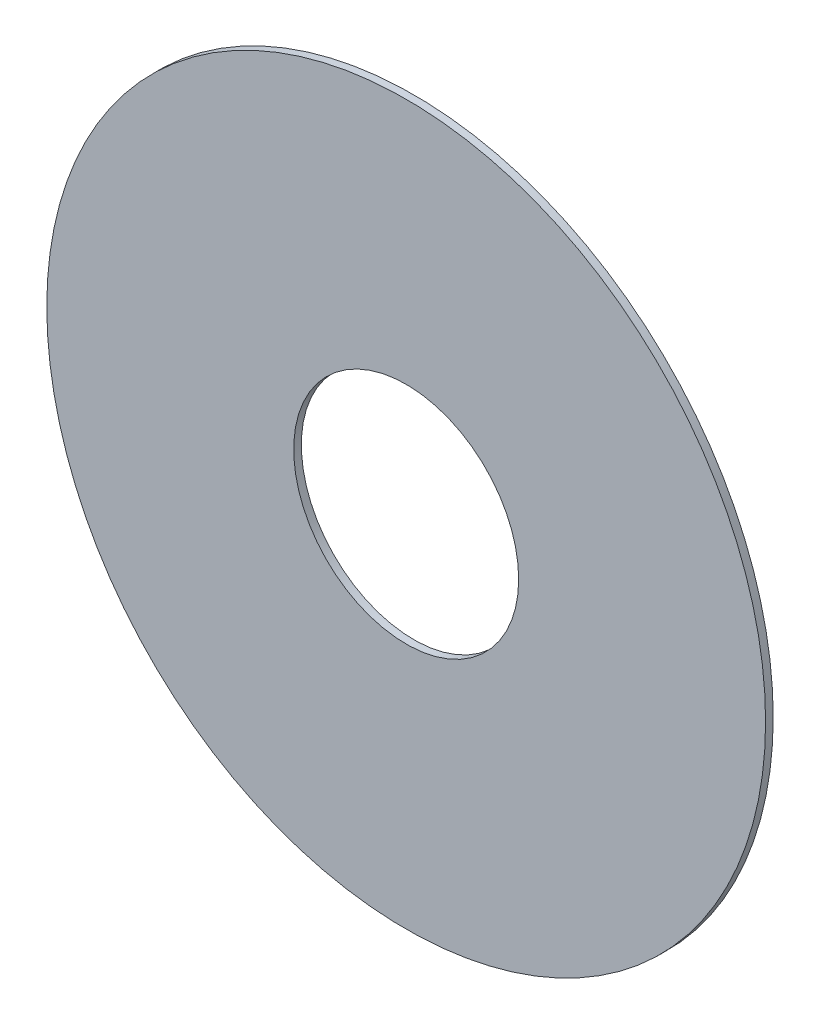
ISO-10303-21;
HEADER;
FILE_DESCRIPTION(('STEP AP214'),'2;1');
FILE_NAME('part.step','',(''),(''),'','','');
FILE_SCHEMA(('AUTOMOTIVE_DESIGN { 1 0 10303 214 1 1 1 1 }'));
ENDSEC;
DATA;
#1=APPLICATION_CONTEXT('core data for automotive mechanical design processes');
#2=APPLICATION_PROTOCOL_DEFINITION('international standard','automotive_design',2000,#1);
#3=PRODUCT_CONTEXT('',#1,'mechanical');
#4=PRODUCT('Part','Part','',(#3));
#5=PRODUCT_RELATED_PRODUCT_CATEGORY('part','',(#4));
#6=PRODUCT_DEFINITION_FORMATION('','',#4);
#7=PRODUCT_DEFINITION_CONTEXT('part definition',#1,'design');
#8=PRODUCT_DEFINITION('design','',#6,#7);
#9=PRODUCT_DEFINITION_SHAPE('','',#8);
#10=(LENGTH_UNIT() NAMED_UNIT(*) SI_UNIT(.MILLI.,.METRE.));
#11=(NAMED_UNIT(*) PLANE_ANGLE_UNIT() SI_UNIT($,.RADIAN.));
#12=(NAMED_UNIT(*) SI_UNIT($,.STERADIAN.) SOLID_ANGLE_UNIT());
#13=UNCERTAINTY_MEASURE_WITH_UNIT(LENGTH_MEASURE(1.E-05),#10,'distance_accuracy_value','');
#14=(GEOMETRIC_REPRESENTATION_CONTEXT(3) GLOBAL_UNCERTAINTY_ASSIGNED_CONTEXT((#13)) GLOBAL_UNIT_ASSIGNED_CONTEXT((#10,
#11,#12)) REPRESENTATION_CONTEXT('',''));
#15=CARTESIAN_POINT('',(0.,0.,0.));
#16=DIRECTION('',(0.,0.,1.));
#17=DIRECTION('',(1.,0.,0.));
#18=AXIS2_PLACEMENT_3D('',#15,#16,#17);
#19=CARTESIAN_POINT('',(0.,0.,-45.5));
#20=DIRECTION('',(0.,0.,1.));
#21=DIRECTION('',(1.,0.,0.));
#22=AXIS2_PLACEMENT_3D('',#19,#20,#21);
#23=PLANE('',#22);
#24=CARTESIAN_POINT('',(0.,0.,-45.5));
#25=DIRECTION('',(0.,0.,1.));
#26=DIRECTION('',(1.,0.,0.));
#27=AXIS2_PLACEMENT_3D('',#24,#25,#26);
#28=CIRCLE('',#27,94.2461538461538);
#29=CARTESIAN_POINT('',(94.2461538461538,0.,-45.5));
#30=VERTEX_POINT('',#29);
#31=EDGE_CURVE('E10',#30,#30,#28,.T.);
#32=ORIENTED_EDGE('',*,*,#31,.T.);
#33=EDGE_LOOP('',(#32));
#34=FACE_BOUND('',#33,.T.);
#35=CARTESIAN_POINT('',(0.,0.,-45.5));
#36=DIRECTION('',(0.,0.,1.));
#37=DIRECTION('',(1.,0.,0.));
#38=AXIS2_PLACEMENT_3D('',#35,#36,#37);
#39=CIRCLE('',#38,29.5);
#40=CARTESIAN_POINT('',(29.5,0.,-45.5));
#41=VERTEX_POINT('',#40);
#42=EDGE_CURVE('E46',#41,#41,#39,.T.);
#43=ORIENTED_EDGE('',*,*,#42,.F.);
#44=EDGE_LOOP('',(#43));
#45=FACE_BOUND('',#44,.T.);
#46=ADVANCED_FACE('F35',(#34,#45),#23,.T.);
#47=CARTESIAN_POINT('',(0.,0.,-47.5));
#48=DIRECTION('',(0.,0.,1.));
#49=DIRECTION('',(1.,0.,0.));
#50=AXIS2_PLACEMENT_3D('',#47,#48,#49);
#51=PLANE('',#50);
#52=CARTESIAN_POINT('',(0.,0.,-47.5));
#53=DIRECTION('',(0.,0.,1.));
#54=DIRECTION('',(1.,0.,0.));
#55=AXIS2_PLACEMENT_3D('',#52,#53,#54);
#56=CIRCLE('',#55,94.2461538461538);
#57=CARTESIAN_POINT('',(94.2461538461538,0.,-47.5));
#58=VERTEX_POINT('',#57);
#59=EDGE_CURVE('E39',#58,#58,#56,.T.);
#60=ORIENTED_EDGE('',*,*,#59,.F.);
#61=EDGE_LOOP('',(#60));
#62=FACE_BOUND('',#61,.T.);
#63=CARTESIAN_POINT('',(0.,0.,-47.5));
#64=DIRECTION('',(0.,0.,1.));
#65=DIRECTION('',(1.,0.,0.));
#66=AXIS2_PLACEMENT_3D('',#63,#64,#65);
#67=CIRCLE('',#66,29.5);
#68=CARTESIAN_POINT('',(29.5,0.,-47.5));
#69=VERTEX_POINT('',#68);
#70=EDGE_CURVE('E48',#69,#69,#67,.T.);
#71=ORIENTED_EDGE('',*,*,#70,.T.);
#72=EDGE_LOOP('',(#71));
#73=FACE_BOUND('',#72,.T.);
#74=ADVANCED_FACE('F58',(#62,#73),#51,.F.);
#75=CARTESIAN_POINT('',(0.,0.,-45.5));
#76=DIRECTION('',(0.,0.,-1.));
#77=DIRECTION('',(-1.,0.,0.));
#78=AXIS2_PLACEMENT_3D('',#75,#76,#77);
#79=CYLINDRICAL_SURFACE('',#78,94.2461538461538);
#80=ORIENTED_EDGE('',*,*,#31,.F.);
#81=EDGE_LOOP('',(#80));
#82=FACE_BOUND('',#81,.T.);
#83=ORIENTED_EDGE('',*,*,#59,.T.);
#84=EDGE_LOOP('',(#83));
#85=FACE_BOUND('',#84,.T.);
#86=ADVANCED_FACE('F37',(#82,#85),#79,.T.);
#87=CARTESIAN_POINT('',(0.,0.,-45.5));
#88=DIRECTION('',(0.,0.,-1.));
#89=DIRECTION('',(-1.,0.,0.));
#90=AXIS2_PLACEMENT_3D('',#87,#88,#89);
#91=CYLINDRICAL_SURFACE('',#90,29.5);
#92=ORIENTED_EDGE('',*,*,#42,.T.);
#93=EDGE_LOOP('',(#92));
#94=FACE_BOUND('',#93,.T.);
#95=ORIENTED_EDGE('',*,*,#70,.F.);
#96=EDGE_LOOP('',(#95));
#97=FACE_BOUND('',#96,.T.);
#98=ADVANCED_FACE('F54',(#94,#97),#91,.F.);
#99=CLOSED_SHELL('',(#46,#74,#86,#98));
#100=MANIFOLD_SOLID_BREP('B2',#99);
#101=ADVANCED_BREP_SHAPE_REPRESENTATION('',(#18,#100),#14);
#102=SHAPE_DEFINITION_REPRESENTATION(#9,#101);
ENDSEC;
END-ISO-10303-21;
